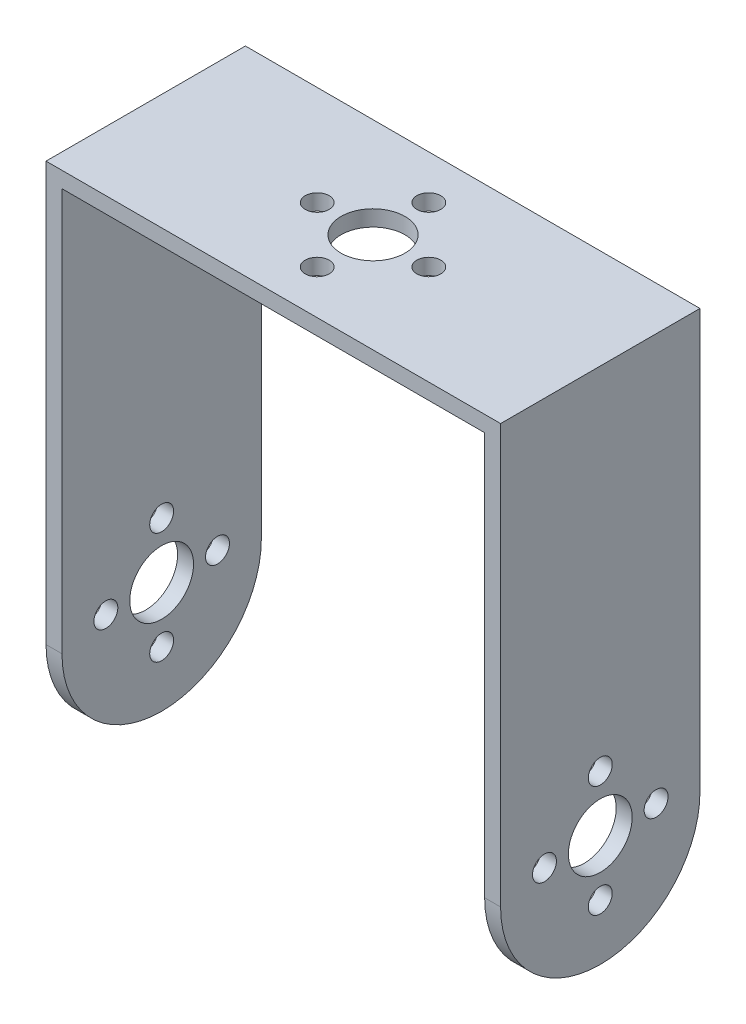
ISO-10303-21;
HEADER;
FILE_DESCRIPTION(('STEP AP214'),'2;1');
FILE_NAME('part.step','',(''),(''),'','','');
FILE_SCHEMA(('AUTOMOTIVE_DESIGN { 1 0 10303 214 1 1 1 1 }'));
ENDSEC;
DATA;
#1=APPLICATION_CONTEXT('core data for automotive mechanical design processes');
#2=APPLICATION_PROTOCOL_DEFINITION('international standard','automotive_design',2000,#1);
#3=PRODUCT_CONTEXT('',#1,'mechanical');
#4=PRODUCT('Part','Part','',(#3));
#5=PRODUCT_RELATED_PRODUCT_CATEGORY('part','',(#4));
#6=PRODUCT_DEFINITION_FORMATION('','',#4);
#7=PRODUCT_DEFINITION_CONTEXT('part definition',#1,'design');
#8=PRODUCT_DEFINITION('design','',#6,#7);
#9=PRODUCT_DEFINITION_SHAPE('','',#8);
#10=(LENGTH_UNIT() NAMED_UNIT(*) SI_UNIT(.MILLI.,.METRE.));
#11=(NAMED_UNIT(*) PLANE_ANGLE_UNIT() SI_UNIT($,.RADIAN.));
#12=(NAMED_UNIT(*) SI_UNIT($,.STERADIAN.) SOLID_ANGLE_UNIT());
#13=UNCERTAINTY_MEASURE_WITH_UNIT(LENGTH_MEASURE(1.E-05),#10,'distance_accuracy_value','');
#14=(GEOMETRIC_REPRESENTATION_CONTEXT(3) GLOBAL_UNCERTAINTY_ASSIGNED_CONTEXT((#13)) GLOBAL_UNIT_ASSIGNED_CONTEXT((#10,
#11,#12)) REPRESENTATION_CONTEXT('',''));
#15=CARTESIAN_POINT('',(0.,0.,0.));
#16=DIRECTION('',(0.,0.,1.));
#17=DIRECTION('',(1.,0.,0.));
#18=AXIS2_PLACEMENT_3D('',#15,#16,#17);
#19=CARTESIAN_POINT('',(-79.925523148209,43.3899538371544,25.));
#20=DIRECTION('',(-1.,0.,0.));
#21=DIRECTION('',(0.,0.,1.));
#22=AXIS2_PLACEMENT_3D('',#19,#20,#21);
#23=PLANE('',#22);
#24=CARTESIAN_POINT('',(-79.925523148209,1.38650673128499,12.5000041477787));
#25=DIRECTION('',(-1.,0.,0.));
#26=DIRECTION('',(0.,0.,1.));
#27=AXIS2_PLACEMENT_3D('',#24,#25,#26);
#28=CIRCLE('',#27,1.5);
#29=CARTESIAN_POINT('',(-79.925523148209,1.38650673128499,14.0000041477787));
#30=VERTEX_POINT('',#29);
#31=EDGE_CURVE('E251',#30,#30,#28,.T.);
#32=ORIENTED_EDGE('',*,*,#31,.T.);
#33=EDGE_LOOP('',(#32));
#34=FACE_BOUND('',#33,.T.);
#35=CARTESIAN_POINT('',(-79.925523148209,-5.61349741649496,19.5000082955587));
#36=DIRECTION('',(-1.,0.,0.));
#37=DIRECTION('',(0.,0.,1.));
#38=AXIS2_PLACEMENT_3D('',#35,#36,#37);
#39=CIRCLE('',#38,1.5);
#40=CARTESIAN_POINT('',(-79.925523148209,-5.61349741649496,21.0000082955587));
#41=VERTEX_POINT('',#40);
#42=EDGE_CURVE('E255',#41,#41,#39,.T.);
#43=ORIENTED_EDGE('',*,*,#42,.T.);
#44=EDGE_LOOP('',(#43));
#45=FACE_BOUND('',#44,.T.);
#46=CARTESIAN_POINT('',(-79.925523148209,-5.61349741649496,5.49999999999877));
#47=DIRECTION('',(-1.,0.,0.));
#48=DIRECTION('',(0.,0.,1.));
#49=AXIS2_PLACEMENT_3D('',#46,#47,#48);
#50=CIRCLE('',#49,1.5);
#51=CARTESIAN_POINT('',(-79.925523148209,-5.61349741649496,6.99999999999877));
#52=VERTEX_POINT('',#51);
#53=EDGE_CURVE('E259',#52,#52,#50,.T.);
#54=ORIENTED_EDGE('',*,*,#53,.T.);
#55=EDGE_LOOP('',(#54));
#56=FACE_BOUND('',#55,.T.);
#57=CARTESIAN_POINT('',(-79.925523148209,-12.6135015642749,12.5000041477787));
#58=DIRECTION('',(-1.,0.,0.));
#59=DIRECTION('',(0.,0.,1.));
#60=AXIS2_PLACEMENT_3D('',#57,#58,#59);
#61=CIRCLE('',#60,1.5);
#62=CARTESIAN_POINT('',(-79.925523148209,-12.6135015642749,14.0000041477787));
#63=VERTEX_POINT('',#62);
#64=EDGE_CURVE('E263',#63,#63,#61,.T.);
#65=ORIENTED_EDGE('',*,*,#64,.T.);
#66=EDGE_LOOP('',(#65));
#67=FACE_BOUND('',#66,.T.);
#68=CARTESIAN_POINT('',(-79.925523148209,-5.61349741649557,12.5));
#69=DIRECTION('',(-1.,0.,0.));
#70=DIRECTION('',(0.,0.,1.));
#71=AXIS2_PLACEMENT_3D('',#68,#69,#70);
#72=CIRCLE('',#71,4.);
#73=CARTESIAN_POINT('',(-79.925523148209,-5.61349741649557,16.5));
#74=VERTEX_POINT('',#73);
#75=EDGE_CURVE('E193',#74,#74,#72,.T.);
#76=ORIENTED_EDGE('',*,*,#75,.T.);
#77=EDGE_LOOP('',(#76));
#78=FACE_BOUND('',#77,.T.);
#79=DIRECTION('',(0.,1.,0.));
#80=VECTOR('',#79,1.);
#81=CARTESIAN_POINT('',(-79.925523148209,43.3899538371544,25.));
#82=LINE('',#81,#80);
#83=CARTESIAN_POINT('',(-79.925523148209,-7.11349741649558,25.));
#84=VERTEX_POINT('',#83);
#85=CARTESIAN_POINT('',(-79.925523148209,43.3899538371544,25.));
#86=VERTEX_POINT('',#85);
#87=EDGE_CURVE('E153',#84,#86,#82,.T.);
#88=ORIENTED_EDGE('',*,*,#87,.F.);
#89=CARTESIAN_POINT('',(-79.925523148209,-7.11349741649558,12.5));
#90=DIRECTION('',(-1.,0.,0.));
#91=DIRECTION('',(0.,0.,1.));
#92=AXIS2_PLACEMENT_3D('',#89,#90,#91);
#93=CIRCLE('',#92,12.5);
#94=CARTESIAN_POINT('',(-79.925523148209,-7.11349741649558,0.));
#95=VERTEX_POINT('',#94);
#96=EDGE_CURVE('E116',#95,#84,#93,.T.);
#97=ORIENTED_EDGE('',*,*,#96,.F.);
#98=DIRECTION('',(0.,1.,0.));
#99=VECTOR('',#98,1.);
#100=CARTESIAN_POINT('',(-79.925523148209,43.3899538371544,0.));
#101=LINE('',#100,#99);
#102=CARTESIAN_POINT('',(-79.925523148209,43.3899538371544,0.));
#103=VERTEX_POINT('',#102);
#104=EDGE_CURVE('E135',#95,#103,#101,.T.);
#105=ORIENTED_EDGE('',*,*,#104,.T.);
#106=DIRECTION('',(0.,0.,-1.));
#107=VECTOR('',#106,1.);
#108=CARTESIAN_POINT('',(-79.925523148209,43.3899538371544,25.));
#109=LINE('',#108,#107);
#110=EDGE_CURVE('E162',#86,#103,#109,.T.);
#111=ORIENTED_EDGE('',*,*,#110,.F.);
#112=EDGE_LOOP('',(#88,#97,#105,#111));
#113=FACE_BOUND('',#112,.T.);
#114=ADVANCED_FACE('F39',(#34,#45,#56,#67,#78,#113),#23,.F.);
#115=CARTESIAN_POINT('',(-26.925523148209,43.3899538371544,25.));
#116=DIRECTION('',(1.,0.,0.));
#117=DIRECTION('',(0.,1.,0.));
#118=AXIS2_PLACEMENT_3D('',#115,#116,#117);
#119=PLANE('',#118);
#120=CARTESIAN_POINT('',(-26.925523148209,1.38650673128501,12.5000041477787));
#121=DIRECTION('',(1.,0.,0.));
#122=DIRECTION('',(0.,1.,0.));
#123=AXIS2_PLACEMENT_3D('',#120,#121,#122);
#124=CIRCLE('',#123,1.5);
#125=CARTESIAN_POINT('',(-26.925523148209,2.88650673128501,12.5000041477787));
#126=VERTEX_POINT('',#125);
#127=EDGE_CURVE('E473',#126,#126,#124,.T.);
#128=ORIENTED_EDGE('',*,*,#127,.T.);
#129=EDGE_LOOP('',(#128));
#130=FACE_BOUND('',#129,.T.);
#131=CARTESIAN_POINT('',(-26.925523148209,-5.61349741649495,19.5000082955587));
#132=DIRECTION('',(1.,0.,0.));
#133=DIRECTION('',(0.,1.,0.));
#134=AXIS2_PLACEMENT_3D('',#131,#132,#133);
#135=CIRCLE('',#134,1.5);
#136=CARTESIAN_POINT('',(-26.925523148209,-4.11349741649494,19.5000082955587));
#137=VERTEX_POINT('',#136);
#138=EDGE_CURVE('E461',#137,#137,#135,.T.);
#139=ORIENTED_EDGE('',*,*,#138,.T.);
#140=EDGE_LOOP('',(#139));
#141=FACE_BOUND('',#140,.T.);
#142=CARTESIAN_POINT('',(-26.925523148209,-5.61349741649495,5.49999999999877));
#143=DIRECTION('',(1.,0.,0.));
#144=DIRECTION('',(0.,1.,0.));
#145=AXIS2_PLACEMENT_3D('',#142,#143,#144);
#146=CIRCLE('',#145,1.5);
#147=CARTESIAN_POINT('',(-26.925523148209,-4.11349741649495,5.49999999999877));
#148=VERTEX_POINT('',#147);
#149=EDGE_CURVE('E319',#148,#148,#146,.T.);
#150=ORIENTED_EDGE('',*,*,#149,.T.);
#151=EDGE_LOOP('',(#150));
#152=FACE_BOUND('',#151,.T.);
#153=CARTESIAN_POINT('',(-26.925523148209,-12.6135015642749,12.5000041477787));
#154=DIRECTION('',(1.,0.,0.));
#155=DIRECTION('',(0.,1.,0.));
#156=AXIS2_PLACEMENT_3D('',#153,#154,#155);
#157=CIRCLE('',#156,1.5);
#158=CARTESIAN_POINT('',(-26.925523148209,-11.1135015642749,12.5000041477787));
#159=VERTEX_POINT('',#158);
#160=EDGE_CURVE('E317',#159,#159,#157,.T.);
#161=ORIENTED_EDGE('',*,*,#160,.T.);
#162=EDGE_LOOP('',(#161));
#163=FACE_BOUND('',#162,.T.);
#164=CARTESIAN_POINT('',(-26.925523148209,-5.61349741649556,12.5));
#165=DIRECTION('',(1.,0.,0.));
#166=DIRECTION('',(0.,1.,0.));
#167=AXIS2_PLACEMENT_3D('',#164,#165,#166);
#168=CIRCLE('',#167,4.);
#169=CARTESIAN_POINT('',(-26.925523148209,-1.61349741649556,12.5));
#170=VERTEX_POINT('',#169);
#171=EDGE_CURVE('E188',#170,#170,#168,.T.);
#172=ORIENTED_EDGE('',*,*,#171,.T.);
#173=EDGE_LOOP('',(#172));
#174=FACE_BOUND('',#173,.T.);
#175=CARTESIAN_POINT('',(-26.925523148209,-7.11349741649557,12.5));
#176=DIRECTION('',(1.,0.,0.));
#177=DIRECTION('',(0.,1.,0.));
#178=AXIS2_PLACEMENT_3D('',#175,#176,#177);
#179=CIRCLE('',#178,12.5);
#180=CARTESIAN_POINT('',(-26.925523148209,-7.11349741649557,25.));
#181=VERTEX_POINT('',#180);
#182=CARTESIAN_POINT('',(-26.925523148209,-7.11349741649558,0.));
#183=VERTEX_POINT('',#182);
#184=EDGE_CURVE('E54',#181,#183,#179,.T.);
#185=ORIENTED_EDGE('',*,*,#184,.F.);
#186=DIRECTION('',(0.,-1.,0.));
#187=VECTOR('',#186,1.);
#188=CARTESIAN_POINT('',(-26.925523148209,43.3899538371544,25.));
#189=LINE('',#188,#187);
#190=CARTESIAN_POINT('',(-26.925523148209,43.3899538371544,25.));
#191=VERTEX_POINT('',#190);
#192=EDGE_CURVE('E209',#191,#181,#189,.T.);
#193=ORIENTED_EDGE('',*,*,#192,.F.);
#194=DIRECTION('',(0.,0.,-1.));
#195=VECTOR('',#194,1.);
#196=CARTESIAN_POINT('',(-26.925523148209,43.3899538371544,25.));
#197=LINE('',#196,#195);
#198=CARTESIAN_POINT('',(-26.925523148209,43.3899538371544,0.));
#199=VERTEX_POINT('',#198);
#200=EDGE_CURVE('E158',#191,#199,#197,.T.);
#201=ORIENTED_EDGE('',*,*,#200,.T.);
#202=DIRECTION('',(0.,-1.,0.));
#203=VECTOR('',#202,1.);
#204=CARTESIAN_POINT('',(-26.925523148209,43.3899538371544,0.));
#205=LINE('',#204,#203);
#206=EDGE_CURVE('E142',#199,#183,#205,.T.);
#207=ORIENTED_EDGE('',*,*,#206,.T.);
#208=EDGE_LOOP('',(#185,#193,#201,#207));
#209=FACE_BOUND('',#208,.T.);
#210=ADVANCED_FACE('F223',(#130,#141,#152,#163,#174,#209),#119,.F.);
#211=CARTESIAN_POINT('',(-24.925523148209,45.3865025835044,25.));
#212=DIRECTION('',(-1.,0.,0.));
#213=DIRECTION('',(0.,-1.,0.));
#214=AXIS2_PLACEMENT_3D('',#211,#212,#213);
#215=PLANE('',#214);
#216=CARTESIAN_POINT('',(-24.925523148209,1.38650673128501,12.5000041477787));
#217=DIRECTION('',(1.,0.,0.));
#218=DIRECTION('',(0.,1.,0.));
#219=AXIS2_PLACEMENT_3D('',#216,#217,#218);
#220=CIRCLE('',#219,1.5);
#221=CARTESIAN_POINT('',(-24.925523148209,2.88650673128501,12.5000041477787));
#222=VERTEX_POINT('',#221);
#223=EDGE_CURVE('E293',#222,#222,#220,.T.);
#224=ORIENTED_EDGE('',*,*,#223,.F.);
#225=EDGE_LOOP('',(#224));
#226=FACE_BOUND('',#225,.T.);
#227=CARTESIAN_POINT('',(-24.925523148209,-5.61349741649494,19.5000082955587));
#228=DIRECTION('',(1.,0.,0.));
#229=DIRECTION('',(0.,1.,0.));
#230=AXIS2_PLACEMENT_3D('',#227,#228,#229);
#231=CIRCLE('',#230,1.5);
#232=CARTESIAN_POINT('',(-24.925523148209,-4.11349741649494,19.5000082955587));
#233=VERTEX_POINT('',#232);
#234=EDGE_CURVE('E297',#233,#233,#231,.T.);
#235=ORIENTED_EDGE('',*,*,#234,.F.);
#236=EDGE_LOOP('',(#235));
#237=FACE_BOUND('',#236,.T.);
#238=CARTESIAN_POINT('',(-24.925523148209,-5.61349741649495,5.49999999999877));
#239=DIRECTION('',(1.,0.,0.));
#240=DIRECTION('',(0.,1.,0.));
#241=AXIS2_PLACEMENT_3D('',#238,#239,#240);
#242=CIRCLE('',#241,1.5);
#243=CARTESIAN_POINT('',(-24.925523148209,-4.11349741649495,5.49999999999877));
#244=VERTEX_POINT('',#243);
#245=EDGE_CURVE('E301',#244,#244,#242,.T.);
#246=ORIENTED_EDGE('',*,*,#245,.F.);
#247=EDGE_LOOP('',(#246));
#248=FACE_BOUND('',#247,.T.);
#249=CARTESIAN_POINT('',(-24.925523148209,-12.6135015642749,12.5000041477787));
#250=DIRECTION('',(1.,0.,0.));
#251=DIRECTION('',(0.,1.,0.));
#252=AXIS2_PLACEMENT_3D('',#249,#250,#251);
#253=CIRCLE('',#252,1.5);
#254=CARTESIAN_POINT('',(-24.925523148209,-11.1135015642749,12.5000041477787));
#255=VERTEX_POINT('',#254);
#256=EDGE_CURVE('E305',#255,#255,#253,.T.);
#257=ORIENTED_EDGE('',*,*,#256,.F.);
#258=EDGE_LOOP('',(#257));
#259=FACE_BOUND('',#258,.T.);
#260=CARTESIAN_POINT('',(-24.9255231482089,-5.61349741649556,12.5));
#261=DIRECTION('',(-1.,0.,0.));
#262=DIRECTION('',(0.,-1.,0.));
#263=AXIS2_PLACEMENT_3D('',#260,#261,#262);
#264=CIRCLE('',#263,4.);
#265=CARTESIAN_POINT('',(-24.9255231482089,-9.61349741649556,12.5));
#266=VERTEX_POINT('',#265);
#267=EDGE_CURVE('E180',#266,#266,#264,.T.);
#268=ORIENTED_EDGE('',*,*,#267,.T.);
#269=EDGE_LOOP('',(#268));
#270=FACE_BOUND('',#269,.T.);
#271=DIRECTION('',(0.,1.,0.));
#272=VECTOR('',#271,1.);
#273=CARTESIAN_POINT('',(-24.925523148209,45.3865025835044,25.));
#274=LINE('',#273,#272);
#275=CARTESIAN_POINT('',(-24.9255231482089,-7.11349741649557,25.));
#276=VERTEX_POINT('',#275);
#277=CARTESIAN_POINT('',(-24.925523148209,45.3865025835044,25.));
#278=VERTEX_POINT('',#277);
#279=EDGE_CURVE('E131',#276,#278,#274,.T.);
#280=ORIENTED_EDGE('',*,*,#279,.F.);
#281=CARTESIAN_POINT('',(-24.9255231482089,-7.11349741649557,12.5));
#282=DIRECTION('',(-1.,0.,0.));
#283=DIRECTION('',(0.,-1.,0.));
#284=AXIS2_PLACEMENT_3D('',#281,#282,#283);
#285=CIRCLE('',#284,12.5);
#286=CARTESIAN_POINT('',(-24.9255231482089,-7.11349741649557,0.));
#287=VERTEX_POINT('',#286);
#288=EDGE_CURVE('E110',#287,#276,#285,.T.);
#289=ORIENTED_EDGE('',*,*,#288,.F.);
#290=DIRECTION('',(0.,1.,0.));
#291=VECTOR('',#290,1.);
#292=CARTESIAN_POINT('',(-24.925523148209,45.3865025835044,0.));
#293=LINE('',#292,#291);
#294=CARTESIAN_POINT('',(-24.925523148209,45.3865025835044,0.));
#295=VERTEX_POINT('',#294);
#296=EDGE_CURVE('E146',#287,#295,#293,.T.);
#297=ORIENTED_EDGE('',*,*,#296,.T.);
#298=DIRECTION('',(0.,0.,-1.));
#299=VECTOR('',#298,1.);
#300=CARTESIAN_POINT('',(-24.925523148209,45.3865025835044,25.));
#301=LINE('',#300,#299);
#302=EDGE_CURVE('E129',#278,#295,#301,.T.);
#303=ORIENTED_EDGE('',*,*,#302,.F.);
#304=EDGE_LOOP('',(#280,#289,#297,#303));
#305=FACE_BOUND('',#304,.T.);
#306=ADVANCED_FACE('F217',(#226,#237,#248,#259,#270,#305),#215,.F.);
#307=CARTESIAN_POINT('',(-81.925523148209,45.3865025835044,25.));
#308=DIRECTION('',(1.,0.,0.));
#309=DIRECTION('',(0.,1.,0.));
#310=AXIS2_PLACEMENT_3D('',#307,#308,#309);
#311=PLANE('',#310);
#312=CARTESIAN_POINT('',(-81.925523148209,1.38650673128499,12.5000041477787));
#313=DIRECTION('',(1.,0.,0.));
#314=DIRECTION('',(0.,1.,0.));
#315=AXIS2_PLACEMENT_3D('',#312,#313,#314);
#316=CIRCLE('',#315,1.5);
#317=CARTESIAN_POINT('',(-81.925523148209,2.88650673128499,12.5000041477787));
#318=VERTEX_POINT('',#317);
#319=EDGE_CURVE('E477',#318,#318,#316,.T.);
#320=ORIENTED_EDGE('',*,*,#319,.T.);
#321=EDGE_LOOP('',(#320));
#322=FACE_BOUND('',#321,.T.);
#323=CARTESIAN_POINT('',(-81.925523148209,-5.61349741649496,19.5000082955587));
#324=DIRECTION('',(1.,0.,0.));
#325=DIRECTION('',(0.,1.,0.));
#326=AXIS2_PLACEMENT_3D('',#323,#324,#325);
#327=CIRCLE('',#326,1.5);
#328=CARTESIAN_POINT('',(-81.925523148209,-4.11349741649496,19.5000082955587));
#329=VERTEX_POINT('',#328);
#330=EDGE_CURVE('E465',#329,#329,#327,.T.);
#331=ORIENTED_EDGE('',*,*,#330,.T.);
#332=EDGE_LOOP('',(#331));
#333=FACE_BOUND('',#332,.T.);
#334=CARTESIAN_POINT('',(-81.925523148209,-5.61349741649496,5.49999999999877));
#335=DIRECTION('',(1.,0.,0.));
#336=DIRECTION('',(0.,1.,0.));
#337=AXIS2_PLACEMENT_3D('',#334,#335,#336);
#338=CIRCLE('',#337,1.5);
#339=CARTESIAN_POINT('',(-81.925523148209,-4.11349741649496,5.49999999999877));
#340=VERTEX_POINT('',#339);
#341=EDGE_CURVE('E449',#340,#340,#338,.T.);
#342=ORIENTED_EDGE('',*,*,#341,.T.);
#343=EDGE_LOOP('',(#342));
#344=FACE_BOUND('',#343,.T.);
#345=CARTESIAN_POINT('',(-81.925523148209,-12.6135015642749,12.5000041477787));
#346=DIRECTION('',(1.,0.,0.));
#347=DIRECTION('',(0.,1.,0.));
#348=AXIS2_PLACEMENT_3D('',#345,#346,#347);
#349=CIRCLE('',#348,1.5);
#350=CARTESIAN_POINT('',(-81.925523148209,-11.1135015642749,12.5000041477787));
#351=VERTEX_POINT('',#350);
#352=EDGE_CURVE('E312',#351,#351,#349,.T.);
#353=ORIENTED_EDGE('',*,*,#352,.T.);
#354=EDGE_LOOP('',(#353));
#355=FACE_BOUND('',#354,.T.);
#356=CARTESIAN_POINT('',(-81.925523148209,-5.61349741649557,12.5));
#357=DIRECTION('',(-1.,0.,0.));
#358=DIRECTION('',(0.,-1.,0.));
#359=AXIS2_PLACEMENT_3D('',#356,#357,#358);
#360=CIRCLE('',#359,4.);
#361=CARTESIAN_POINT('',(-81.925523148209,-9.61349741649557,12.5));
#362=VERTEX_POINT('',#361);
#363=EDGE_CURVE('E175',#362,#362,#360,.T.);
#364=ORIENTED_EDGE('',*,*,#363,.F.);
#365=EDGE_LOOP('',(#364));
#366=FACE_BOUND('',#365,.T.);
#367=CARTESIAN_POINT('',(-81.925523148209,-7.11349741649558,12.5));
#368=DIRECTION('',(-1.,0.,0.));
#369=DIRECTION('',(0.,-1.,0.));
#370=AXIS2_PLACEMENT_3D('',#367,#368,#369);
#371=CIRCLE('',#370,12.5);
#372=CARTESIAN_POINT('',(-81.925523148209,-7.11349741649558,0.));
#373=VERTEX_POINT('',#372);
#374=CARTESIAN_POINT('',(-81.925523148209,-7.11349741649558,25.));
#375=VERTEX_POINT('',#374);
#376=EDGE_CURVE('E61',#373,#375,#371,.T.);
#377=ORIENTED_EDGE('',*,*,#376,.T.);
#378=DIRECTION('',(0.,-1.,0.));
#379=VECTOR('',#378,1.);
#380=CARTESIAN_POINT('',(-81.925523148209,45.3865025835044,25.));
#381=LINE('',#380,#379);
#382=CARTESIAN_POINT('',(-81.925523148209,45.3865025835044,25.));
#383=VERTEX_POINT('',#382);
#384=EDGE_CURVE('E106',#383,#375,#381,.T.);
#385=ORIENTED_EDGE('',*,*,#384,.F.);
#386=DIRECTION('',(0.,0.,-1.));
#387=VECTOR('',#386,1.);
#388=CARTESIAN_POINT('',(-81.925523148209,45.3865025835044,25.));
#389=LINE('',#388,#387);
#390=CARTESIAN_POINT('',(-81.925523148209,45.3865025835044,0.));
#391=VERTEX_POINT('',#390);
#392=EDGE_CURVE('E125',#383,#391,#389,.T.);
#393=ORIENTED_EDGE('',*,*,#392,.T.);
#394=DIRECTION('',(0.,-1.,0.));
#395=VECTOR('',#394,1.);
#396=CARTESIAN_POINT('',(-81.925523148209,45.3865025835044,0.));
#397=LINE('',#396,#395);
#398=EDGE_CURVE('E108',#391,#373,#397,.T.);
#399=ORIENTED_EDGE('',*,*,#398,.T.);
#400=EDGE_LOOP('',(#377,#385,#393,#399));
#401=FACE_BOUND('',#400,.T.);
#402=ADVANCED_FACE('F103',(#322,#333,#344,#355,#366,#401),#311,.F.);
#403=CARTESIAN_POINT('',(-79.925523148209,43.3899538371544,25.));
#404=DIRECTION('',(0.,1.,0.));
#405=DIRECTION('',(0.,0.,1.));
#406=AXIS2_PLACEMENT_3D('',#403,#404,#405);
#407=PLANE('',#406);
#408=CARTESIAN_POINT('',(-60.425523148209,43.3899538371544,12.4999988656517));
#409=DIRECTION('',(0.,1.,0.));
#410=DIRECTION('',(0.,0.,1.));
#411=AXIS2_PLACEMENT_3D('',#408,#409,#410);
#412=CIRCLE('',#411,1.5);
#413=CARTESIAN_POINT('',(-60.425523148209,43.3899538371544,13.9999988656518));
#414=VERTEX_POINT('',#413);
#415=EDGE_CURVE('E507',#414,#414,#412,.T.);
#416=ORIENTED_EDGE('',*,*,#415,.T.);
#417=EDGE_LOOP('',(#416));
#418=FACE_BOUND('',#417,.T.);
#419=CARTESIAN_POINT('',(-53.4255231482089,43.3899538371544,19.4999988656516));
#420=DIRECTION('',(0.,1.,0.));
#421=DIRECTION('',(0.,0.,1.));
#422=AXIS2_PLACEMENT_3D('',#419,#420,#421);
#423=CIRCLE('',#422,1.5);
#424=CARTESIAN_POINT('',(-53.4255231482089,43.3899538371544,20.9999988656517));
#425=VERTEX_POINT('',#424);
#426=EDGE_CURVE('E499',#425,#425,#423,.T.);
#427=ORIENTED_EDGE('',*,*,#426,.T.);
#428=EDGE_LOOP('',(#427));
#429=FACE_BOUND('',#428,.T.);
#430=CARTESIAN_POINT('',(-46.425523148209,43.3899538371544,12.4999988656515));
#431=DIRECTION('',(0.,1.,0.));
#432=DIRECTION('',(0.,0.,1.));
#433=AXIS2_PLACEMENT_3D('',#430,#431,#432);
#434=CIRCLE('',#433,1.5);
#435=CARTESIAN_POINT('',(-46.425523148209,43.3899538371544,13.9999988656516));
#436=VERTEX_POINT('',#435);
#437=EDGE_CURVE('E491',#436,#436,#434,.T.);
#438=ORIENTED_EDGE('',*,*,#437,.T.);
#439=EDGE_LOOP('',(#438));
#440=FACE_BOUND('',#439,.T.);
#441=CARTESIAN_POINT('',(-53.4255231482091,43.3899538371544,5.49999886565165));
#442=DIRECTION('',(0.,1.,0.));
#443=DIRECTION('',(0.,0.,1.));
#444=AXIS2_PLACEMENT_3D('',#441,#442,#443);
#445=CIRCLE('',#444,1.5);
#446=CARTESIAN_POINT('',(-53.4255231482091,43.3899538371544,6.99999886565165));
#447=VERTEX_POINT('',#446);
#448=EDGE_CURVE('E480',#447,#447,#445,.T.);
#449=ORIENTED_EDGE('',*,*,#448,.T.);
#450=EDGE_LOOP('',(#449));
#451=FACE_BOUND('',#450,.T.);
#452=CARTESIAN_POINT('',(-53.425523148209,43.3899538371544,12.5));
#453=DIRECTION('',(0.,1.,0.));
#454=DIRECTION('',(0.,0.,1.));
#455=AXIS2_PLACEMENT_3D('',#452,#453,#454);
#456=CIRCLE('',#455,4.00000000000001);
#457=CARTESIAN_POINT('',(-53.425523148209,43.3899538371544,16.5));
#458=VERTEX_POINT('',#457);
#459=EDGE_CURVE('E139',#458,#458,#456,.T.);
#460=ORIENTED_EDGE('',*,*,#459,.T.);
#461=EDGE_LOOP('',(#460));
#462=FACE_BOUND('',#461,.T.);
#463=DIRECTION('',(1.,0.,0.));
#464=VECTOR('',#463,1.);
#465=CARTESIAN_POINT('',(-79.925523148209,43.3899538371544,0.));
#466=LINE('',#465,#464);
#467=EDGE_CURVE('E138',#103,#199,#466,.T.);
#468=ORIENTED_EDGE('',*,*,#467,.T.);
#469=ORIENTED_EDGE('',*,*,#200,.F.);
#470=DIRECTION('',(1.,0.,0.));
#471=VECTOR('',#470,1.);
#472=CARTESIAN_POINT('',(-79.925523148209,43.3899538371544,25.));
#473=LINE('',#472,#471);
#474=EDGE_CURVE('E206',#86,#191,#473,.T.);
#475=ORIENTED_EDGE('',*,*,#474,.F.);
#476=ORIENTED_EDGE('',*,*,#110,.T.);
#477=EDGE_LOOP('',(#468,#469,#475,#476));
#478=FACE_BOUND('',#477,.T.);
#479=ADVANCED_FACE('F228',(#418,#429,#440,#451,#462,#478),#407,.F.);
#480=CARTESIAN_POINT('',(-81.925523148209,45.3865025835044,25.));
#481=DIRECTION('',(0.,-1.,0.));
#482=DIRECTION('',(0.,0.,-1.));
#483=AXIS2_PLACEMENT_3D('',#480,#481,#482);
#484=PLANE('',#483);
#485=CARTESIAN_POINT('',(-60.425523148209,45.3865025835044,12.4999988656517));
#486=DIRECTION('',(0.,1.,0.));
#487=DIRECTION('',(0.,0.,1.));
#488=AXIS2_PLACEMENT_3D('',#485,#486,#487);
#489=CIRCLE('',#488,1.5);
#490=CARTESIAN_POINT('',(-60.425523148209,45.3865025835044,13.9999988656518));
#491=VERTEX_POINT('',#490);
#492=EDGE_CURVE('E510',#491,#491,#489,.T.);
#493=ORIENTED_EDGE('',*,*,#492,.F.);
#494=EDGE_LOOP('',(#493));
#495=FACE_BOUND('',#494,.T.);
#496=CARTESIAN_POINT('',(-53.4255231482089,45.3865025835044,19.4999988656516));
#497=DIRECTION('',(0.,1.,0.));
#498=DIRECTION('',(0.,0.,1.));
#499=AXIS2_PLACEMENT_3D('',#496,#497,#498);
#500=CIRCLE('',#499,1.5);
#501=CARTESIAN_POINT('',(-53.4255231482089,45.3865025835044,20.9999988656517));
#502=VERTEX_POINT('',#501);
#503=EDGE_CURVE('E503',#502,#502,#500,.T.);
#504=ORIENTED_EDGE('',*,*,#503,.F.);
#505=EDGE_LOOP('',(#504));
#506=FACE_BOUND('',#505,.T.);
#507=CARTESIAN_POINT('',(-46.425523148209,45.3865025835044,12.4999988656515));
#508=DIRECTION('',(0.,1.,0.));
#509=DIRECTION('',(0.,0.,1.));
#510=AXIS2_PLACEMENT_3D('',#507,#508,#509);
#511=CIRCLE('',#510,1.5);
#512=CARTESIAN_POINT('',(-46.425523148209,45.3865025835044,13.9999988656516));
#513=VERTEX_POINT('',#512);
#514=EDGE_CURVE('E495',#513,#513,#511,.T.);
#515=ORIENTED_EDGE('',*,*,#514,.F.);
#516=EDGE_LOOP('',(#515));
#517=FACE_BOUND('',#516,.T.);
#518=CARTESIAN_POINT('',(-53.4255231482091,45.3865025835044,5.49999886565165));
#519=DIRECTION('',(0.,1.,0.));
#520=DIRECTION('',(0.,0.,1.));
#521=AXIS2_PLACEMENT_3D('',#518,#519,#520);
#522=CIRCLE('',#521,1.5);
#523=CARTESIAN_POINT('',(-53.4255231482091,45.3865025835044,6.99999886565165));
#524=VERTEX_POINT('',#523);
#525=EDGE_CURVE('E487',#524,#524,#522,.T.);
#526=ORIENTED_EDGE('',*,*,#525,.F.);
#527=EDGE_LOOP('',(#526));
#528=FACE_BOUND('',#527,.T.);
#529=CARTESIAN_POINT('',(-53.425523148209,45.3865025835044,12.5));
#530=DIRECTION('',(0.,1.,0.));
#531=DIRECTION('',(0.,0.,1.));
#532=AXIS2_PLACEMENT_3D('',#529,#530,#531);
#533=CIRCLE('',#532,4.00000000000001);
#534=CARTESIAN_POINT('',(-53.425523148209,45.3865025835044,16.5));
#535=VERTEX_POINT('',#534);
#536=EDGE_CURVE('E197',#535,#535,#533,.T.);
#537=ORIENTED_EDGE('',*,*,#536,.F.);
#538=EDGE_LOOP('',(#537));
#539=FACE_BOUND('',#538,.T.);
#540=DIRECTION('',(-1.,0.,0.));
#541=VECTOR('',#540,1.);
#542=CARTESIAN_POINT('',(-81.925523148209,45.3865025835044,0.));
#543=LINE('',#542,#541);
#544=EDGE_CURVE('E149',#295,#391,#543,.T.);
#545=ORIENTED_EDGE('',*,*,#544,.T.);
#546=ORIENTED_EDGE('',*,*,#392,.F.);
#547=DIRECTION('',(-1.,0.,0.));
#548=VECTOR('',#547,1.);
#549=CARTESIAN_POINT('',(-27.0429671921119,45.3865025835044,25.));
#550=LINE('',#549,#548);
#551=EDGE_CURVE('E122',#278,#383,#550,.T.);
#552=ORIENTED_EDGE('',*,*,#551,.F.);
#553=ORIENTED_EDGE('',*,*,#302,.T.);
#554=EDGE_LOOP('',(#545,#546,#552,#553));
#555=FACE_BOUND('',#554,.T.);
#556=ADVANCED_FACE('F219',(#495,#506,#517,#528,#539,#555),#484,.F.);
#557=CARTESIAN_POINT('',(0.,0.,25.));
#558=DIRECTION('',(0.,0.,1.));
#559=DIRECTION('',(1.,0.,0.));
#560=AXIS2_PLACEMENT_3D('',#557,#558,#559);
#561=PLANE('',#560);
#562=DIRECTION('',(-1.,0.,0.));
#563=VECTOR('',#562,1.);
#564=CARTESIAN_POINT('',(-24.9255231482089,-7.11349741649557,25.));
#565=LINE('',#564,#563);
#566=EDGE_CURVE('E111',#276,#181,#565,.T.);
#567=ORIENTED_EDGE('',*,*,#566,.F.);
#568=ORIENTED_EDGE('',*,*,#279,.T.);
#569=ORIENTED_EDGE('',*,*,#551,.T.);
#570=ORIENTED_EDGE('',*,*,#384,.T.);
#571=DIRECTION('',(-1.,0.,0.));
#572=VECTOR('',#571,1.);
#573=CARTESIAN_POINT('',(-24.9255231482089,-7.11349741649557,25.));
#574=LINE('',#573,#572);
#575=EDGE_CURVE('E11',#84,#375,#574,.T.);
#576=ORIENTED_EDGE('',*,*,#575,.F.);
#577=ORIENTED_EDGE('',*,*,#87,.T.);
#578=ORIENTED_EDGE('',*,*,#474,.T.);
#579=ORIENTED_EDGE('',*,*,#192,.T.);
#580=EDGE_LOOP('',(#567,#568,#569,#570,#576,#577,#578,#579));
#581=FACE_BOUND('',#580,.T.);
#582=ADVANCED_FACE('F120',(#581),#561,.T.);
#583=CARTESIAN_POINT('',(0.,0.,0.));
#584=DIRECTION('',(0.,0.,1.));
#585=DIRECTION('',(1.,0.,0.));
#586=AXIS2_PLACEMENT_3D('',#583,#584,#585);
#587=PLANE('',#586);
#588=ORIENTED_EDGE('',*,*,#296,.F.);
#589=DIRECTION('',(-1.,0.,0.));
#590=VECTOR('',#589,1.);
#591=CARTESIAN_POINT('',(-24.9255231482089,-7.11349741649557,0.));
#592=LINE('',#591,#590);
#593=EDGE_CURVE('E182',#287,#183,#592,.T.);
#594=ORIENTED_EDGE('',*,*,#593,.T.);
#595=ORIENTED_EDGE('',*,*,#206,.F.);
#596=ORIENTED_EDGE('',*,*,#467,.F.);
#597=ORIENTED_EDGE('',*,*,#104,.F.);
#598=DIRECTION('',(-1.,0.,0.));
#599=VECTOR('',#598,1.);
#600=CARTESIAN_POINT('',(-24.9255231482089,-7.11349741649557,0.));
#601=LINE('',#600,#599);
#602=EDGE_CURVE('E47',#95,#373,#601,.T.);
#603=ORIENTED_EDGE('',*,*,#602,.T.);
#604=ORIENTED_EDGE('',*,*,#398,.F.);
#605=ORIENTED_EDGE('',*,*,#544,.F.);
#606=EDGE_LOOP('',(#588,#594,#595,#596,#597,#603,#604,#605));
#607=FACE_BOUND('',#606,.T.);
#608=ADVANCED_FACE('F169',(#607),#587,.F.);
#609=CARTESIAN_POINT('',(-53.425523148209,-19.6134974164956,12.5));
#610=DIRECTION('',(0.,1.,0.));
#611=DIRECTION('',(0.,0.,1.));
#612=AXIS2_PLACEMENT_3D('',#609,#610,#611);
#613=CYLINDRICAL_SURFACE('',#612,4.00000000000001);
#614=ORIENTED_EDGE('',*,*,#536,.T.);
#615=EDGE_LOOP('',(#614));
#616=FACE_BOUND('',#615,.T.);
#617=ORIENTED_EDGE('',*,*,#459,.F.);
#618=EDGE_LOOP('',(#617));
#619=FACE_BOUND('',#618,.T.);
#620=ADVANCED_FACE('F269',(#616,#619),#613,.F.);
#621=CARTESIAN_POINT('',(-24.9255231482089,-5.61349741649556,12.5));
#622=DIRECTION('',(-1.,0.,0.));
#623=DIRECTION('',(0.,-1.,0.));
#624=AXIS2_PLACEMENT_3D('',#621,#622,#623);
#625=CYLINDRICAL_SURFACE('',#624,4.);
#626=ORIENTED_EDGE('',*,*,#363,.T.);
#627=EDGE_LOOP('',(#626));
#628=FACE_BOUND('',#627,.T.);
#629=ORIENTED_EDGE('',*,*,#75,.F.);
#630=EDGE_LOOP('',(#629));
#631=FACE_BOUND('',#630,.T.);
#632=ADVANCED_FACE('F266',(#628,#631),#625,.F.);
#633=ORIENTED_EDGE('',*,*,#267,.F.);
#634=EDGE_LOOP('',(#633));
#635=FACE_BOUND('',#634,.T.);
#636=ORIENTED_EDGE('',*,*,#171,.F.);
#637=EDGE_LOOP('',(#636));
#638=FACE_BOUND('',#637,.T.);
#639=ADVANCED_FACE('F268',(#635,#638),#625,.F.);
#640=CARTESIAN_POINT('',(-24.9255231482089,-7.11349741649557,12.5));
#641=DIRECTION('',(-1.,0.,0.));
#642=DIRECTION('',(0.,-1.,0.));
#643=AXIS2_PLACEMENT_3D('',#640,#641,#642);
#644=CYLINDRICAL_SURFACE('',#643,12.5);
#645=ORIENTED_EDGE('',*,*,#96,.T.);
#646=ORIENTED_EDGE('',*,*,#575,.T.);
#647=ORIENTED_EDGE('',*,*,#376,.F.);
#648=ORIENTED_EDGE('',*,*,#602,.F.);
#649=EDGE_LOOP('',(#645,#646,#647,#648));
#650=FACE_BOUND('',#649,.T.);
#651=ADVANCED_FACE('F114',(#650),#644,.T.);
#652=ORIENTED_EDGE('',*,*,#184,.T.);
#653=ORIENTED_EDGE('',*,*,#593,.F.);
#654=ORIENTED_EDGE('',*,*,#288,.T.);
#655=ORIENTED_EDGE('',*,*,#566,.T.);
#656=EDGE_LOOP('',(#652,#653,#654,#655));
#657=FACE_BOUND('',#656,.T.);
#658=ADVANCED_FACE('F330',(#657),#644,.T.);
#659=CARTESIAN_POINT('',(-81.925523148209,-12.6135015642749,12.5000041477787));
#660=DIRECTION('',(1.,0.,0.));
#661=DIRECTION('',(0.,1.,0.));
#662=AXIS2_PLACEMENT_3D('',#659,#660,#661);
#663=CYLINDRICAL_SURFACE('',#662,1.5);
#664=ORIENTED_EDGE('',*,*,#352,.F.);
#665=EDGE_LOOP('',(#664));
#666=FACE_BOUND('',#665,.T.);
#667=ORIENTED_EDGE('',*,*,#64,.F.);
#668=EDGE_LOOP('',(#667));
#669=FACE_BOUND('',#668,.T.);
#670=ADVANCED_FACE('F332',(#666,#669),#663,.F.);
#671=ORIENTED_EDGE('',*,*,#256,.T.);
#672=EDGE_LOOP('',(#671));
#673=FACE_BOUND('',#672,.T.);
#674=ORIENTED_EDGE('',*,*,#160,.F.);
#675=EDGE_LOOP('',(#674));
#676=FACE_BOUND('',#675,.T.);
#677=ADVANCED_FACE('F337',(#673,#676),#663,.F.);
#678=CARTESIAN_POINT('',(-81.925523148209,-5.61349741649496,5.49999999999877));
#679=DIRECTION('',(1.,0.,0.));
#680=DIRECTION('',(0.,1.,0.));
#681=AXIS2_PLACEMENT_3D('',#678,#679,#680);
#682=CYLINDRICAL_SURFACE('',#681,1.5);
#683=ORIENTED_EDGE('',*,*,#341,.F.);
#684=EDGE_LOOP('',(#683));
#685=FACE_BOUND('',#684,.T.);
#686=ORIENTED_EDGE('',*,*,#53,.F.);
#687=EDGE_LOOP('',(#686));
#688=FACE_BOUND('',#687,.T.);
#689=ADVANCED_FACE('F438',(#685,#688),#682,.F.);
#690=ORIENTED_EDGE('',*,*,#245,.T.);
#691=EDGE_LOOP('',(#690));
#692=FACE_BOUND('',#691,.T.);
#693=ORIENTED_EDGE('',*,*,#149,.F.);
#694=EDGE_LOOP('',(#693));
#695=FACE_BOUND('',#694,.T.);
#696=ADVANCED_FACE('F436',(#692,#695),#682,.F.);
#697=CARTESIAN_POINT('',(-81.925523148209,-5.61349741649496,19.5000082955587));
#698=DIRECTION('',(1.,0.,0.));
#699=DIRECTION('',(0.,1.,0.));
#700=AXIS2_PLACEMENT_3D('',#697,#698,#699);
#701=CYLINDRICAL_SURFACE('',#700,1.5);
#702=ORIENTED_EDGE('',*,*,#330,.F.);
#703=EDGE_LOOP('',(#702));
#704=FACE_BOUND('',#703,.T.);
#705=ORIENTED_EDGE('',*,*,#42,.F.);
#706=EDGE_LOOP('',(#705));
#707=FACE_BOUND('',#706,.T.);
#708=ADVANCED_FACE('F433',(#704,#707),#701,.F.);
#709=ORIENTED_EDGE('',*,*,#234,.T.);
#710=EDGE_LOOP('',(#709));
#711=FACE_BOUND('',#710,.T.);
#712=ORIENTED_EDGE('',*,*,#138,.F.);
#713=EDGE_LOOP('',(#712));
#714=FACE_BOUND('',#713,.T.);
#715=ADVANCED_FACE('F431',(#711,#714),#701,.F.);
#716=CARTESIAN_POINT('',(-81.925523148209,1.38650673128499,12.5000041477787));
#717=DIRECTION('',(1.,0.,0.));
#718=DIRECTION('',(0.,1.,0.));
#719=AXIS2_PLACEMENT_3D('',#716,#717,#718);
#720=CYLINDRICAL_SURFACE('',#719,1.5);
#721=ORIENTED_EDGE('',*,*,#319,.F.);
#722=EDGE_LOOP('',(#721));
#723=FACE_BOUND('',#722,.T.);
#724=ORIENTED_EDGE('',*,*,#31,.F.);
#725=EDGE_LOOP('',(#724));
#726=FACE_BOUND('',#725,.T.);
#727=ADVANCED_FACE('F428',(#723,#726),#720,.F.);
#728=ORIENTED_EDGE('',*,*,#223,.T.);
#729=EDGE_LOOP('',(#728));
#730=FACE_BOUND('',#729,.T.);
#731=ORIENTED_EDGE('',*,*,#127,.F.);
#732=EDGE_LOOP('',(#731));
#733=FACE_BOUND('',#732,.T.);
#734=ADVANCED_FACE('F389',(#730,#733),#720,.F.);
#735=CARTESIAN_POINT('',(-53.4255231482091,-19.6134974164956,5.49999886565165));
#736=DIRECTION('',(0.,1.,0.));
#737=DIRECTION('',(0.,0.,1.));
#738=AXIS2_PLACEMENT_3D('',#735,#736,#737);
#739=CYLINDRICAL_SURFACE('',#738,1.5);
#740=ORIENTED_EDGE('',*,*,#525,.T.);
#741=EDGE_LOOP('',(#740));
#742=FACE_BOUND('',#741,.T.);
#743=ORIENTED_EDGE('',*,*,#448,.F.);
#744=EDGE_LOOP('',(#743));
#745=FACE_BOUND('',#744,.T.);
#746=ADVANCED_FACE('F383',(#742,#745),#739,.F.);
#747=CARTESIAN_POINT('',(-46.425523148209,-19.6134974164956,12.4999988656515));
#748=DIRECTION('',(0.,1.,0.));
#749=DIRECTION('',(0.,0.,1.));
#750=AXIS2_PLACEMENT_3D('',#747,#748,#749);
#751=CYLINDRICAL_SURFACE('',#750,1.5);
#752=ORIENTED_EDGE('',*,*,#514,.T.);
#753=EDGE_LOOP('',(#752));
#754=FACE_BOUND('',#753,.T.);
#755=ORIENTED_EDGE('',*,*,#437,.F.);
#756=EDGE_LOOP('',(#755));
#757=FACE_BOUND('',#756,.T.);
#758=ADVANCED_FACE('F388',(#754,#757),#751,.F.);
#759=CARTESIAN_POINT('',(-53.4255231482089,-19.6134974164956,19.4999988656516));
#760=DIRECTION('',(0.,1.,0.));
#761=DIRECTION('',(0.,0.,1.));
#762=AXIS2_PLACEMENT_3D('',#759,#760,#761);
#763=CYLINDRICAL_SURFACE('',#762,1.5);
#764=ORIENTED_EDGE('',*,*,#503,.T.);
#765=EDGE_LOOP('',(#764));
#766=FACE_BOUND('',#765,.T.);
#767=ORIENTED_EDGE('',*,*,#426,.F.);
#768=EDGE_LOOP('',(#767));
#769=FACE_BOUND('',#768,.T.);
#770=ADVANCED_FACE('F401',(#766,#769),#763,.F.);
#771=CARTESIAN_POINT('',(-60.425523148209,-19.6134974164956,12.4999988656517));
#772=DIRECTION('',(0.,1.,0.));
#773=DIRECTION('',(0.,0.,1.));
#774=AXIS2_PLACEMENT_3D('',#771,#772,#773);
#775=CYLINDRICAL_SURFACE('',#774,1.5);
#776=ORIENTED_EDGE('',*,*,#492,.T.);
#777=EDGE_LOOP('',(#776));
#778=FACE_BOUND('',#777,.T.);
#779=ORIENTED_EDGE('',*,*,#415,.F.);
#780=EDGE_LOOP('',(#779));
#781=FACE_BOUND('',#780,.T.);
#782=ADVANCED_FACE('F411',(#778,#781),#775,.F.);
#783=CLOSED_SHELL('',(#114,#210,#306,#402,#479,#556,#582,#608,#620,#632,#639,#651,#658,#670,
#677,#689,#696,#708,#715,#727,#734,#746,#758,#770,#782));
#784=MANIFOLD_SOLID_BREP('B2',#783);
#785=ADVANCED_BREP_SHAPE_REPRESENTATION('',(#18,#784),#14);
#786=SHAPE_DEFINITION_REPRESENTATION(#9,#785);
ENDSEC;
END-ISO-10303-21;
